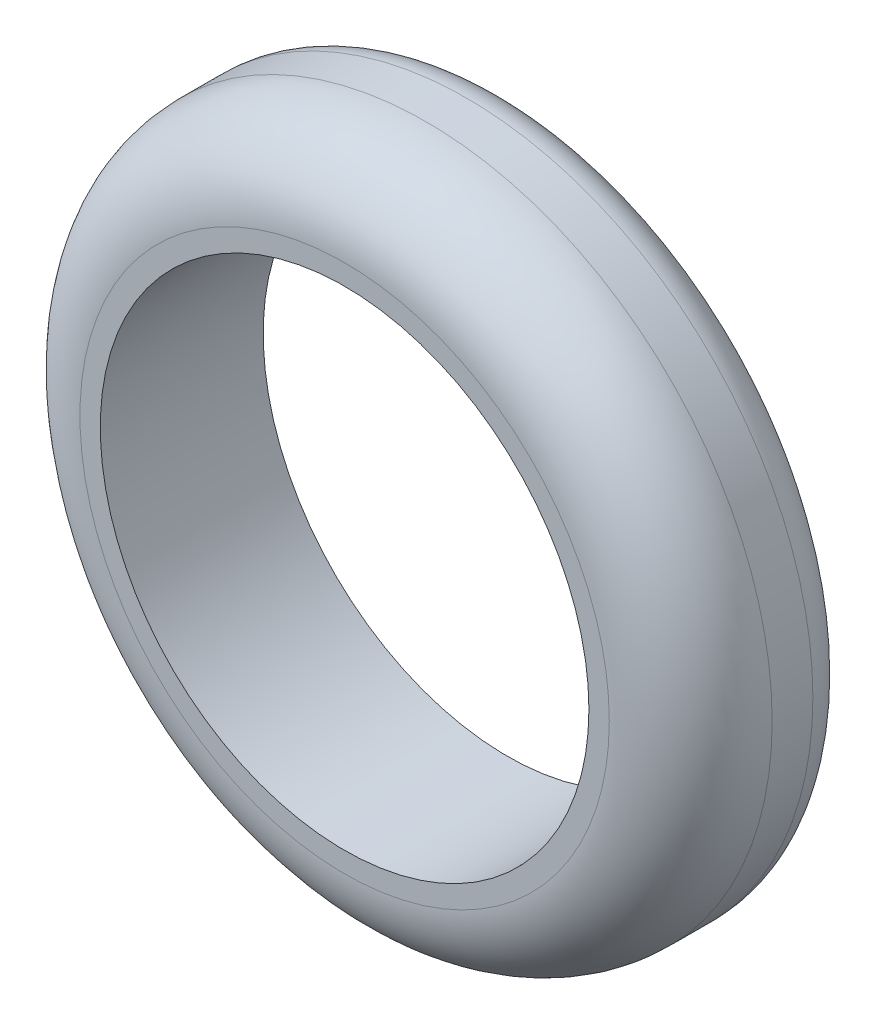
ISO-10303-21;
HEADER;
FILE_DESCRIPTION(('STEP AP214'),'2;1');
FILE_NAME('part.step','',(''),(''),'','','');
FILE_SCHEMA(('AUTOMOTIVE_DESIGN { 1 0 10303 214 1 1 1 1 }'));
ENDSEC;
DATA;
#1=APPLICATION_CONTEXT('core data for automotive mechanical design processes');
#2=APPLICATION_PROTOCOL_DEFINITION('international standard','automotive_design',2000,#1);
#3=PRODUCT_CONTEXT('',#1,'mechanical');
#4=PRODUCT('Part','Part','',(#3));
#5=PRODUCT_RELATED_PRODUCT_CATEGORY('part','',(#4));
#6=PRODUCT_DEFINITION_FORMATION('','',#4);
#7=PRODUCT_DEFINITION_CONTEXT('part definition',#1,'design');
#8=PRODUCT_DEFINITION('design','',#6,#7);
#9=PRODUCT_DEFINITION_SHAPE('','',#8);
#10=(LENGTH_UNIT() NAMED_UNIT(*) SI_UNIT(.MILLI.,.METRE.));
#11=(NAMED_UNIT(*) PLANE_ANGLE_UNIT() SI_UNIT($,.RADIAN.));
#12=(NAMED_UNIT(*) SI_UNIT($,.STERADIAN.) SOLID_ANGLE_UNIT());
#13=UNCERTAINTY_MEASURE_WITH_UNIT(LENGTH_MEASURE(1.E-05),#10,'distance_accuracy_value','');
#14=(GEOMETRIC_REPRESENTATION_CONTEXT(3) GLOBAL_UNCERTAINTY_ASSIGNED_CONTEXT((#13)) GLOBAL_UNIT_ASSIGNED_CONTEXT((#10,
#11,#12)) REPRESENTATION_CONTEXT('',''));
#15=CARTESIAN_POINT('',(0.,0.,0.));
#16=DIRECTION('',(0.,0.,1.));
#17=DIRECTION('',(1.,0.,0.));
#18=AXIS2_PLACEMENT_3D('',#15,#16,#17);
#19=CARTESIAN_POINT('',(0.,0.,2.));
#20=DIRECTION('',(0.,0.,-1.));
#21=DIRECTION('',(-1.,0.,0.));
#22=AXIS2_PLACEMENT_3D('',#19,#20,#21);
#23=CYLINDRICAL_SURFACE('',#22,3.);
#24=CARTESIAN_POINT('',(0.,0.,2.));
#25=DIRECTION('',(0.,0.,1.));
#26=DIRECTION('',(1.,0.,0.));
#27=AXIS2_PLACEMENT_3D('',#24,#25,#26);
#28=CIRCLE('',#27,3.);
#29=CARTESIAN_POINT('',(3.,0.,2.));
#30=VERTEX_POINT('',#29);
#31=EDGE_CURVE('E50',#30,#30,#28,.T.);
#32=ORIENTED_EDGE('',*,*,#31,.T.);
#33=EDGE_LOOP('',(#32));
#34=FACE_BOUND('',#33,.T.);
#35=CARTESIAN_POINT('',(0.,0.,0.));
#36=DIRECTION('',(0.,0.,1.));
#37=DIRECTION('',(1.,0.,0.));
#38=AXIS2_PLACEMENT_3D('',#35,#36,#37);
#39=CIRCLE('',#38,3.);
#40=CARTESIAN_POINT('',(3.,0.,0.));
#41=VERTEX_POINT('',#40);
#42=EDGE_CURVE('E51',#41,#41,#39,.T.);
#43=ORIENTED_EDGE('',*,*,#42,.F.);
#44=EDGE_LOOP('',(#43));
#45=FACE_BOUND('',#44,.T.);
#46=ADVANCED_FACE('F30',(#34,#45),#23,.F.);
#47=CARTESIAN_POINT('',(0.,0.,2.));
#48=DIRECTION('',(0.,0.,-1.));
#49=DIRECTION('',(-1.,0.,0.));
#50=AXIS2_PLACEMENT_3D('',#47,#48,#49);
#51=CYLINDRICAL_SURFACE('',#50,4.25);
#52=CARTESIAN_POINT('',(0.,0.,0.5));
#53=DIRECTION('',(0.,0.,1.));
#54=DIRECTION('',(1.,0.,0.));
#55=AXIS2_PLACEMENT_3D('',#52,#53,#54);
#56=CIRCLE('',#55,4.25);
#57=CARTESIAN_POINT('',(4.25,0.,0.5));
#58=VERTEX_POINT('',#57);
#59=EDGE_CURVE('E37',#58,#58,#56,.T.);
#60=ORIENTED_EDGE('',*,*,#59,.T.);
#61=EDGE_LOOP('',(#60));
#62=FACE_BOUND('',#61,.T.);
#63=CARTESIAN_POINT('',(0.,0.,1.));
#64=DIRECTION('',(0.,0.,1.));
#65=DIRECTION('',(1.,0.,0.));
#66=AXIS2_PLACEMENT_3D('',#63,#64,#65);
#67=CIRCLE('',#66,4.25);
#68=CARTESIAN_POINT('',(4.25,0.,1.));
#69=VERTEX_POINT('',#68);
#70=EDGE_CURVE('E41',#69,#69,#67,.F.);
#71=ORIENTED_EDGE('',*,*,#70,.T.);
#72=EDGE_LOOP('',(#71));
#73=FACE_BOUND('',#72,.T.);
#74=ADVANCED_FACE('F62',(#62,#73),#51,.T.);
#75=CARTESIAN_POINT('',(0.,0.,2.));
#76=DIRECTION('',(0.,0.,1.));
#77=DIRECTION('',(1.,0.,0.));
#78=AXIS2_PLACEMENT_3D('',#75,#76,#77);
#79=PLANE('',#78);
#80=CARTESIAN_POINT('',(0.,0.,2.));
#81=DIRECTION('',(0.,0.,1.));
#82=DIRECTION('',(1.,0.,0.));
#83=AXIS2_PLACEMENT_3D('',#80,#81,#82);
#84=CIRCLE('',#83,3.25);
#85=CARTESIAN_POINT('',(3.25,0.,2.));
#86=VERTEX_POINT('',#85);
#87=EDGE_CURVE('E45',#86,#86,#84,.T.);
#88=ORIENTED_EDGE('',*,*,#87,.T.);
#89=EDGE_LOOP('',(#88));
#90=FACE_BOUND('',#89,.T.);
#91=ORIENTED_EDGE('',*,*,#31,.F.);
#92=EDGE_LOOP('',(#91));
#93=FACE_BOUND('',#92,.T.);
#94=ADVANCED_FACE('F59',(#90,#93),#79,.T.);
#95=CARTESIAN_POINT('',(0.,0.,0.));
#96=DIRECTION('',(0.,0.,1.));
#97=DIRECTION('',(1.,0.,0.));
#98=AXIS2_PLACEMENT_3D('',#95,#96,#97);
#99=PLANE('',#98);
#100=CARTESIAN_POINT('',(0.,0.,0.));
#101=DIRECTION('',(0.,0.,1.));
#102=DIRECTION('',(1.,0.,0.));
#103=AXIS2_PLACEMENT_3D('',#100,#101,#102);
#104=CIRCLE('',#103,3.75);
#105=CARTESIAN_POINT('',(3.75,0.,0.));
#106=VERTEX_POINT('',#105);
#107=EDGE_CURVE('E10',#106,#106,#104,.F.);
#108=ORIENTED_EDGE('',*,*,#107,.T.);
#109=EDGE_LOOP('',(#108));
#110=FACE_BOUND('',#109,.T.);
#111=ORIENTED_EDGE('',*,*,#42,.T.);
#112=EDGE_LOOP('',(#111));
#113=FACE_BOUND('',#112,.T.);
#114=ADVANCED_FACE('F61',(#110,#113),#99,.F.);
#115=CARTESIAN_POINT('',(0.,0.,1.));
#116=DIRECTION('',(0.,0.,1.));
#117=DIRECTION('',(1.,0.,0.));
#118=AXIS2_PLACEMENT_3D('',#115,#116,#117);
#119=TOROIDAL_SURFACE('',#118,3.25,1.);
#120=ORIENTED_EDGE('',*,*,#70,.F.);
#121=EDGE_LOOP('',(#120));
#122=FACE_BOUND('',#121,.T.);
#123=ORIENTED_EDGE('',*,*,#87,.F.);
#124=EDGE_LOOP('',(#123));
#125=FACE_BOUND('',#124,.T.);
#126=ADVANCED_FACE('F69',(#122,#125),#119,.T.);
#127=CARTESIAN_POINT('',(0.,0.,0.5));
#128=DIRECTION('',(0.,0.,1.));
#129=DIRECTION('',(1.,0.,0.));
#130=AXIS2_PLACEMENT_3D('',#127,#128,#129);
#131=TOROIDAL_SURFACE('',#130,3.75,0.5);
#132=ORIENTED_EDGE('',*,*,#107,.F.);
#133=EDGE_LOOP('',(#132));
#134=FACE_BOUND('',#133,.T.);
#135=ORIENTED_EDGE('',*,*,#59,.F.);
#136=EDGE_LOOP('',(#135));
#137=FACE_BOUND('',#136,.T.);
#138=ADVANCED_FACE('F32',(#134,#137),#131,.T.);
#139=CLOSED_SHELL('',(#46,#74,#94,#114,#126,#138));
#140=MANIFOLD_SOLID_BREP('B2',#139);
#141=ADVANCED_BREP_SHAPE_REPRESENTATION('',(#18,#140),#14);
#142=SHAPE_DEFINITION_REPRESENTATION(#9,#141);
ENDSEC;
END-ISO-10303-21;
